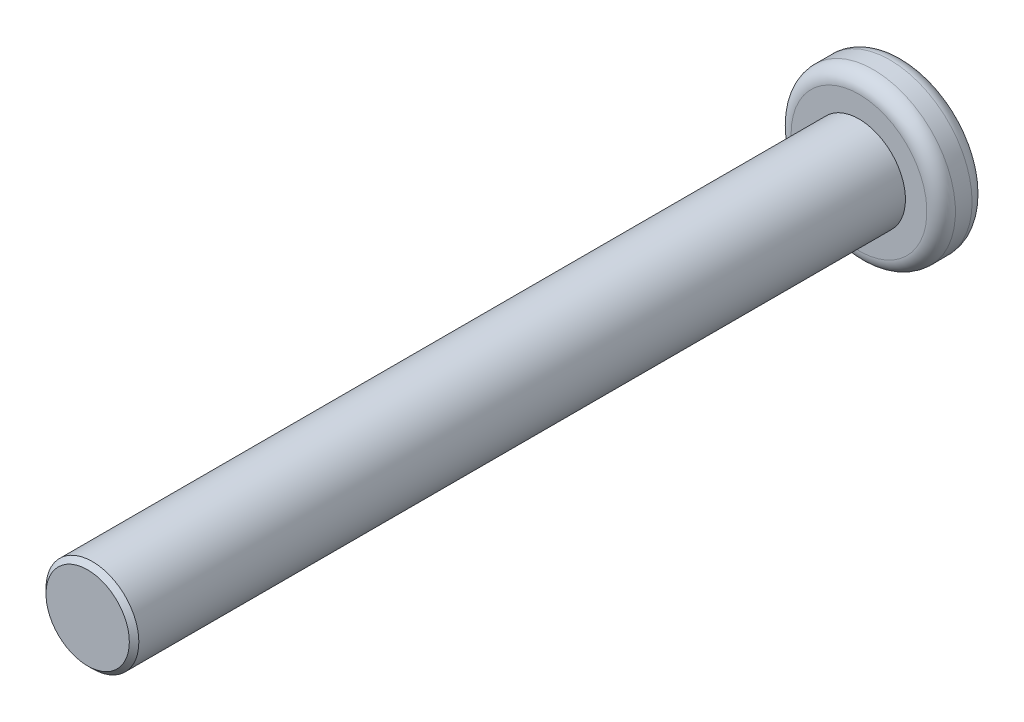
ISO-10303-21;
HEADER;
FILE_DESCRIPTION(('STEP AP214'),'2;1');
FILE_NAME('part.step','',(''),(''),'','','');
FILE_SCHEMA(('AUTOMOTIVE_DESIGN { 1 0 10303 214 1 1 1 1 }'));
ENDSEC;
DATA;
#1=APPLICATION_CONTEXT('core data for automotive mechanical design processes');
#2=APPLICATION_PROTOCOL_DEFINITION('international standard','automotive_design',2000,#1);
#3=PRODUCT_CONTEXT('',#1,'mechanical');
#4=PRODUCT('Part','Part','',(#3));
#5=PRODUCT_RELATED_PRODUCT_CATEGORY('part','',(#4));
#6=PRODUCT_DEFINITION_FORMATION('','',#4);
#7=PRODUCT_DEFINITION_CONTEXT('part definition',#1,'design');
#8=PRODUCT_DEFINITION('design','',#6,#7);
#9=PRODUCT_DEFINITION_SHAPE('','',#8);
#10=(LENGTH_UNIT() NAMED_UNIT(*) SI_UNIT(.MILLI.,.METRE.));
#11=(NAMED_UNIT(*) PLANE_ANGLE_UNIT() SI_UNIT($,.RADIAN.));
#12=(NAMED_UNIT(*) SI_UNIT($,.STERADIAN.) SOLID_ANGLE_UNIT());
#13=UNCERTAINTY_MEASURE_WITH_UNIT(LENGTH_MEASURE(1.E-05),#10,'distance_accuracy_value','');
#14=(GEOMETRIC_REPRESENTATION_CONTEXT(3) GLOBAL_UNCERTAINTY_ASSIGNED_CONTEXT((#13)) GLOBAL_UNIT_ASSIGNED_CONTEXT((#10,
#11,#12)) REPRESENTATION_CONTEXT('',''));
#15=CARTESIAN_POINT('',(0.,0.,0.));
#16=DIRECTION('',(0.,0.,1.));
#17=DIRECTION('',(1.,0.,0.));
#18=AXIS2_PLACEMENT_3D('',#15,#16,#17);
#19=CARTESIAN_POINT('',(0.,0.,68.7592322875999));
#20=DIRECTION('',(0.,0.,-1.));
#21=DIRECTION('',(-1.,0.,0.));
#22=AXIS2_PLACEMENT_3D('',#19,#20,#21);
#23=CYLINDRICAL_SURFACE('',#22,6.3375);
#24=CARTESIAN_POINT('',(0.,0.,68.1092322875999));
#25=DIRECTION('',(0.,0.,1.));
#26=DIRECTION('',(1.,0.,0.));
#27=AXIS2_PLACEMENT_3D('',#24,#25,#26);
#28=CIRCLE('',#27,6.3375);
#29=CARTESIAN_POINT('',(6.3375,0.,68.1092322875999));
#30=VERTEX_POINT('',#29);
#31=EDGE_CURVE('E10',#30,#30,#28,.F.);
#32=ORIENTED_EDGE('',*,*,#31,.T.);
#33=EDGE_LOOP('',(#32));
#34=FACE_BOUND('',#33,.T.);
#35=CARTESIAN_POINT('',(0.,0.,-36.5407677124001));
#36=DIRECTION('',(0.,0.,-1.));
#37=DIRECTION('',(-1.,0.,0.));
#38=AXIS2_PLACEMENT_3D('',#35,#36,#37);
#39=CIRCLE('',#38,6.3375);
#40=CARTESIAN_POINT('',(-6.3375,0.,-36.5407677124001));
#41=VERTEX_POINT('',#40);
#42=EDGE_CURVE('E59',#41,#41,#39,.T.);
#43=ORIENTED_EDGE('',*,*,#42,.F.);
#44=EDGE_LOOP('',(#43));
#45=FACE_BOUND('',#44,.T.);
#46=ADVANCED_FACE('F33',(#34,#45),#23,.T.);
#47=CARTESIAN_POINT('',(0.,0.,68.7592322875999));
#48=DIRECTION('',(0.,0.,1.));
#49=DIRECTION('',(1.,0.,0.));
#50=AXIS2_PLACEMENT_3D('',#47,#48,#49);
#51=PLANE('',#50);
#52=CARTESIAN_POINT('',(0.,0.,68.7592322875999));
#53=DIRECTION('',(0.,0.,1.));
#54=DIRECTION('',(1.,0.,0.));
#55=AXIS2_PLACEMENT_3D('',#52,#53,#54);
#56=CIRCLE('',#55,5.68750000000002);
#57=CARTESIAN_POINT('',(5.68750000000002,0.,68.7592322875999));
#58=VERTEX_POINT('',#57);
#59=EDGE_CURVE('E40',#58,#58,#56,.T.);
#60=ORIENTED_EDGE('',*,*,#59,.T.);
#61=EDGE_LOOP('',(#60));
#62=FACE_BOUND('',#61,.T.);
#63=ADVANCED_FACE('F66',(#62),#51,.T.);
#64=CARTESIAN_POINT('',(0.,0.,-36.5407677124001));
#65=DIRECTION('',(0.,0.,-1.));
#66=DIRECTION('',(-1.,0.,0.));
#67=AXIS2_PLACEMENT_3D('',#64,#65,#66);
#68=PLANE('',#67);
#69=CARTESIAN_POINT('',(0.,0.,-36.5407677124001));
#70=DIRECTION('',(0.,0.,-1.));
#71=DIRECTION('',(-1.,0.,0.));
#72=AXIS2_PLACEMENT_3D('',#69,#70,#71);
#73=CIRCLE('',#72,9.2625);
#74=CARTESIAN_POINT('',(-9.2625,0.,-36.5407677124001));
#75=VERTEX_POINT('',#74);
#76=EDGE_CURVE('E44',#75,#75,#73,.F.);
#77=ORIENTED_EDGE('',*,*,#76,.T.);
#78=EDGE_LOOP('',(#77));
#79=FACE_BOUND('',#78,.T.);
#80=ORIENTED_EDGE('',*,*,#42,.T.);
#81=EDGE_LOOP('',(#80));
#82=FACE_BOUND('',#81,.T.);
#83=ADVANCED_FACE('F63',(#79,#82),#68,.F.);
#84=CARTESIAN_POINT('',(0.,0.,-36.5407677124001));
#85=DIRECTION('',(0.,0.,-1.));
#86=DIRECTION('',(-1.,0.,0.));
#87=AXIS2_PLACEMENT_3D('',#84,#85,#86);
#88=CYLINDRICAL_SURFACE('',#87,11.2125);
#89=CARTESIAN_POINT('',(0.,0.,-40.7657677124001));
#90=DIRECTION('',(0.,0.,1.));
#91=DIRECTION('',(1.,0.,0.));
#92=AXIS2_PLACEMENT_3D('',#89,#90,#91);
#93=CIRCLE('',#92,11.2125);
#94=CARTESIAN_POINT('',(-11.2125,0.,-40.7657677124001));
#95=VERTEX_POINT('',#94);
#96=EDGE_CURVE('E48',#95,#95,#93,.T.);
#97=CARTESIAN_POINT('',(0.,0.,-38.4907677124001));
#98=DIRECTION('',(0.,0.,-1.));
#99=DIRECTION('',(-1.,0.,0.));
#100=AXIS2_PLACEMENT_3D('',#97,#98,#99);
#101=CIRCLE('',#100,11.2125);
#102=CARTESIAN_POINT('',(-11.2125,0.,-38.4907677124001));
#103=VERTEX_POINT('',#102);
#104=EDGE_CURVE('E53',#103,#103,#101,.T.);
#105=CARTESIAN_POINT('',(-11.2125,0.,-40.7657677124001));
#106=CARTESIAN_POINT('',(-11.2125,0.,-40.7420697957334));
#107=CARTESIAN_POINT('',(-11.2125,0.,-40.7183718790668));
#108=CARTESIAN_POINT('',(-11.2125,0.,-40.6709760457334));
#109=CARTESIAN_POINT('',(-11.2125,0.,-40.6472781290668));
#110=CARTESIAN_POINT('',(-11.2125,0.,-40.5998822957334));
#111=CARTESIAN_POINT('',(-11.2125,0.,-40.5761843790668));
#112=CARTESIAN_POINT('',(-11.2125,0.,-40.5287885457334));
#113=CARTESIAN_POINT('',(-11.2125,0.,-40.5050906290668));
#114=CARTESIAN_POINT('',(-11.2125,0.,-40.4576947957334));
#115=CARTESIAN_POINT('',(-11.2125,0.,-40.4339968790668));
#116=CARTESIAN_POINT('',(-11.2125,0.,-40.3866010457334));
#117=CARTESIAN_POINT('',(-11.2125,0.,-40.3629031290668));
#118=CARTESIAN_POINT('',(-11.2125,0.,-40.3155072957334));
#119=CARTESIAN_POINT('',(-11.2125,0.,-40.2918093790668));
#120=CARTESIAN_POINT('',(-11.2125,0.,-40.2444135457334));
#121=CARTESIAN_POINT('',(-11.2125,0.,-40.2207156290668));
#122=CARTESIAN_POINT('',(-11.2125,0.,-40.1733197957334));
#123=CARTESIAN_POINT('',(-11.2125,0.,-40.1496218790668));
#124=CARTESIAN_POINT('',(-11.2125,0.,-40.1022260457334));
#125=CARTESIAN_POINT('',(-11.2125,0.,-40.0785281290668));
#126=CARTESIAN_POINT('',(-11.2125,0.,-40.0311322957334));
#127=CARTESIAN_POINT('',(-11.2125,0.,-40.0074343790668));
#128=CARTESIAN_POINT('',(-11.2125,0.,-39.9600385457334));
#129=CARTESIAN_POINT('',(-11.2125,0.,-39.9363406290668));
#130=CARTESIAN_POINT('',(-11.2125,0.,-39.8889447957334));
#131=CARTESIAN_POINT('',(-11.2125,0.,-39.8652468790668));
#132=CARTESIAN_POINT('',(-11.2125,0.,-39.8178510457334));
#133=CARTESIAN_POINT('',(-11.2125,0.,-39.7941531290668));
#134=CARTESIAN_POINT('',(-11.2125,0.,-39.7467572957334));
#135=CARTESIAN_POINT('',(-11.2125,0.,-39.7230593790668));
#136=CARTESIAN_POINT('',(-11.2125,0.,-39.6756635457334));
#137=CARTESIAN_POINT('',(-11.2125,0.,-39.6519656290668));
#138=CARTESIAN_POINT('',(-11.2125,0.,-39.6045697957334));
#139=CARTESIAN_POINT('',(-11.2125,0.,-39.5808718790668));
#140=CARTESIAN_POINT('',(-11.2125,0.,-39.5334760457334));
#141=CARTESIAN_POINT('',(-11.2125,0.,-39.5097781290668));
#142=CARTESIAN_POINT('',(-11.2125,0.,-39.4623822957334));
#143=CARTESIAN_POINT('',(-11.2125,0.,-39.4386843790668));
#144=CARTESIAN_POINT('',(-11.2125,0.,-39.3912885457334));
#145=CARTESIAN_POINT('',(-11.2125,0.,-39.3675906290668));
#146=CARTESIAN_POINT('',(-11.2125,0.,-39.3201947957334));
#147=CARTESIAN_POINT('',(-11.2125,0.,-39.2964968790668));
#148=CARTESIAN_POINT('',(-11.2125,0.,-39.2491010457334));
#149=CARTESIAN_POINT('',(-11.2125,0.,-39.2254031290668));
#150=CARTESIAN_POINT('',(-11.2125,0.,-39.1780072957334));
#151=CARTESIAN_POINT('',(-11.2125,0.,-39.1543093790668));
#152=CARTESIAN_POINT('',(-11.2125,0.,-39.1069135457334));
#153=CARTESIAN_POINT('',(-11.2125,0.,-39.0832156290668));
#154=CARTESIAN_POINT('',(-11.2125,0.,-39.0358197957334));
#155=CARTESIAN_POINT('',(-11.2125,0.,-39.0121218790668));
#156=CARTESIAN_POINT('',(-11.2125,0.,-38.9647260457334));
#157=CARTESIAN_POINT('',(-11.2125,0.,-38.9410281290668));
#158=CARTESIAN_POINT('',(-11.2125,0.,-38.8936322957334));
#159=CARTESIAN_POINT('',(-11.2125,0.,-38.8699343790668));
#160=CARTESIAN_POINT('',(-11.2125,0.,-38.8225385457334));
#161=CARTESIAN_POINT('',(-11.2125,0.,-38.7988406290668));
#162=CARTESIAN_POINT('',(-11.2125,0.,-38.7514447957334));
#163=CARTESIAN_POINT('',(-11.2125,0.,-38.7277468790668));
#164=CARTESIAN_POINT('',(-11.2125,0.,-38.6803510457334));
#165=CARTESIAN_POINT('',(-11.2125,0.,-38.6566531290668));
#166=CARTESIAN_POINT('',(-11.2125,0.,-38.6092572957334));
#167=CARTESIAN_POINT('',(-11.2125,0.,-38.5855593790668));
#168=CARTESIAN_POINT('',(-11.2125,0.,-38.5381635457334));
#169=CARTESIAN_POINT('',(-11.2125,0.,-38.5144656290668));
#170=CARTESIAN_POINT('',(-11.2125,0.,-38.4907677124001));
#171=B_SPLINE_CURVE_WITH_KNOTS('',3,(#105,#106,#107,#108,#109,#110,#111,#112,#113,#114,#115,
#116,#117,#118,#119,#120,#121,#122,#123,#124,#125,#126,#127,#128,#129,#130,#131,#132,#133,#134,
#135,#136,#137,#138,#139,#140,#141,#142,#143,#144,#145,#146,#147,#148,#149,#150,#151,#152,#153,
#154,#155,#156,#157,#158,#159,#160,#161,#162,#163,#164,#165,#166,#167,#168,#169,#170),
.UNSPECIFIED.,.F.,.F.,(4,2,2,2,2,2,2,2,2,2,2,2,2,2,2,2,2,2,2,2,2,2,2,2,2,2,2,2,2,2,2,2,4),(0.,
0.0710937500000008,0.142187500000002,0.213281250000003,0.284375000000003,0.355468750000004,
0.426562500000005,0.497656250000006,0.568750000000007,0.639843750000008,0.710937500000002,
0.782031250000002,0.853125000000003,0.924218750000004,0.995312500000005,1.06640625000001,
1.13750000000001,1.20859375000001,1.27968750000001,1.35078125000001,1.42187500000001,
1.49296875000001,1.5640625,1.63515625000001,1.70625000000001,1.77734375000001,1.84843750000001,
1.91953125000001,1.99062500000001,2.06171875000001,2.13281250000001,2.20390625000001,
2.27500000000001),.UNSPECIFIED.);
#172=EDGE_CURVE('BSEAM89',#95,#103,#171,.T.);
#173=ORIENTED_EDGE('',*,*,#96,.T.);
#174=ORIENTED_EDGE('',*,*,#104,.T.);
#175=ORIENTED_EDGE('',*,*,#172,.T.);
#176=ORIENTED_EDGE('',*,*,#172,.F.);
#177=EDGE_LOOP('',(#173,#175,#174,#176));
#178=FACE_BOUND('',#177,.T.);
#179=ADVANCED_FACE('F89',(#178),#88,.T.);
#180=CARTESIAN_POINT('',(0.,0.,-42.7157677124001));
#181=DIRECTION('',(0.,0.,1.));
#182=DIRECTION('',(1.,0.,0.));
#183=AXIS2_PLACEMENT_3D('',#180,#181,#182);
#184=PLANE('',#183);
#185=CARTESIAN_POINT('',(0.,0.,-42.7157677124001));
#186=DIRECTION('',(0.,0.,1.));
#187=DIRECTION('',(1.,0.,0.));
#188=AXIS2_PLACEMENT_3D('',#185,#186,#187);
#189=CIRCLE('',#188,9.2625);
#190=CARTESIAN_POINT('',(9.2625,0.,-42.7157677124001));
#191=VERTEX_POINT('',#190);
#192=EDGE_CURVE('E56',#191,#191,#189,.F.);
#193=ORIENTED_EDGE('',*,*,#192,.T.);
#194=EDGE_LOOP('',(#193));
#195=FACE_BOUND('',#194,.T.);
#196=ADVANCED_FACE('F74',(#195),#184,.F.);
#197=CARTESIAN_POINT('',(0.,0.,-40.7657677124001));
#198=DIRECTION('',(0.,0.,1.));
#199=DIRECTION('',(1.,0.,0.));
#200=AXIS2_PLACEMENT_3D('',#197,#198,#199);
#201=TOROIDAL_SURFACE('',#200,9.2625,1.95);
#202=ORIENTED_EDGE('',*,*,#96,.F.);
#203=EDGE_LOOP('',(#202));
#204=FACE_BOUND('',#203,.T.);
#205=ORIENTED_EDGE('',*,*,#192,.F.);
#206=EDGE_LOOP('',(#205));
#207=FACE_BOUND('',#206,.T.);
#208=ADVANCED_FACE('F75',(#204,#207),#201,.T.);
#209=CARTESIAN_POINT('',(0.,0.,-38.4907677124001));
#210=DIRECTION('',(0.,0.,-1.));
#211=DIRECTION('',(-1.,0.,0.));
#212=AXIS2_PLACEMENT_3D('',#209,#210,#211);
#213=TOROIDAL_SURFACE('',#212,9.2625,1.95);
#214=ORIENTED_EDGE('',*,*,#76,.F.);
#215=EDGE_LOOP('',(#214));
#216=FACE_BOUND('',#215,.T.);
#217=ORIENTED_EDGE('',*,*,#104,.F.);
#218=EDGE_LOOP('',(#217));
#219=FACE_BOUND('',#218,.T.);
#220=ADVANCED_FACE('F77',(#216,#219),#213,.T.);
#221=CARTESIAN_POINT('',(0.,0.,68.7592322875999));
#222=DIRECTION('',(0.,0.,-1.));
#223=DIRECTION('',(-1.,0.,0.));
#224=AXIS2_PLACEMENT_3D('',#221,#222,#223);
#225=CONICAL_SURFACE('',#224,5.68750000000002,0.785398163397458);
#226=ORIENTED_EDGE('',*,*,#31,.F.);
#227=EDGE_LOOP('',(#226));
#228=FACE_BOUND('',#227,.T.);
#229=ORIENTED_EDGE('',*,*,#59,.F.);
#230=EDGE_LOOP('',(#229));
#231=FACE_BOUND('',#230,.T.);
#232=ADVANCED_FACE('F35',(#228,#231),#225,.T.);
#233=CLOSED_SHELL('',(#46,#63,#83,#179,#196,#208,#220,#232));
#234=MANIFOLD_SOLID_BREP('B2',#233);
#235=ADVANCED_BREP_SHAPE_REPRESENTATION('',(#18,#234),#14);
#236=SHAPE_DEFINITION_REPRESENTATION(#9,#235);
ENDSEC;
END-ISO-10303-21;
